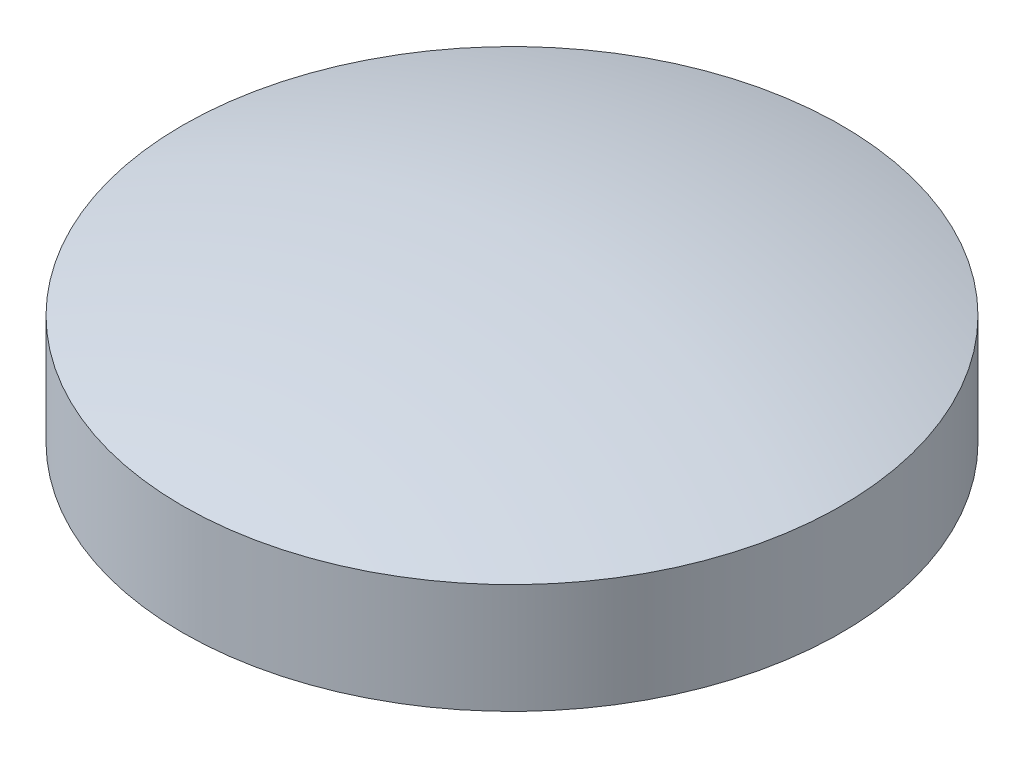
ISO-10303-21;
HEADER;
FILE_DESCRIPTION(('STEP AP214'),'2;1');
FILE_NAME('part.step','',(''),(''),'','','');
FILE_SCHEMA(('AUTOMOTIVE_DESIGN { 1 0 10303 214 1 1 1 1 }'));
ENDSEC;
DATA;
#1=APPLICATION_CONTEXT('core data for automotive mechanical design processes');
#2=APPLICATION_PROTOCOL_DEFINITION('international standard','automotive_design',2000,#1);
#3=PRODUCT_CONTEXT('',#1,'mechanical');
#4=PRODUCT('Part','Part','',(#3));
#5=PRODUCT_RELATED_PRODUCT_CATEGORY('part','',(#4));
#6=PRODUCT_DEFINITION_FORMATION('','',#4);
#7=PRODUCT_DEFINITION_CONTEXT('part definition',#1,'design');
#8=PRODUCT_DEFINITION('design','',#6,#7);
#9=PRODUCT_DEFINITION_SHAPE('','',#8);
#10=(LENGTH_UNIT() NAMED_UNIT(*) SI_UNIT(.MILLI.,.METRE.));
#11=(NAMED_UNIT(*) PLANE_ANGLE_UNIT() SI_UNIT($,.RADIAN.));
#12=(NAMED_UNIT(*) SI_UNIT($,.STERADIAN.) SOLID_ANGLE_UNIT());
#13=UNCERTAINTY_MEASURE_WITH_UNIT(LENGTH_MEASURE(1.E-05),#10,'distance_accuracy_value','');
#14=(GEOMETRIC_REPRESENTATION_CONTEXT(3) GLOBAL_UNCERTAINTY_ASSIGNED_CONTEXT((#13)) GLOBAL_UNIT_ASSIGNED_CONTEXT((#10,
#11,#12)) REPRESENTATION_CONTEXT('',''));
#15=CARTESIAN_POINT('',(0.,0.,0.));
#16=DIRECTION('',(0.,0.,1.));
#17=DIRECTION('',(1.,0.,0.));
#18=AXIS2_PLACEMENT_3D('',#15,#16,#17);
#19=CARTESIAN_POINT('',(0.,-5.42363520850167,0.));
#20=DIRECTION('',(0.,1.,0.));
#21=DIRECTION('',(-1.,0.,0.));
#22=AXIS2_PLACEMENT_3D('',#19,#20,#21);
#23=SPHERICAL_SURFACE('',#22,6.);
#24=CARTESIAN_POINT('',(0.,0.3,0.));
#25=DIRECTION('',(0.,1.,0.));
#26=DIRECTION('',(0.,0.,1.));
#27=AXIS2_PLACEMENT_3D('',#24,#25,#26);
#28=CIRCLE('',#27,1.8);
#29=CARTESIAN_POINT('',(0.,0.3,1.8));
#30=VERTEX_POINT('',#29);
#31=EDGE_CURVE('E10',#30,#30,#28,.T.);
#32=ORIENTED_EDGE('',*,*,#31,.T.);
#33=EDGE_LOOP('',(#32));
#34=FACE_BOUND('',#33,.T.);
#35=ADVANCED_FACE('F32',(#34),#23,.T.);
#36=CARTESIAN_POINT('',(0.,1.10783961392649,0.));
#37=DIRECTION('',(0.,1.,0.));
#38=DIRECTION('',(0.,0.,1.));
#39=AXIS2_PLACEMENT_3D('',#36,#37,#38);
#40=CYLINDRICAL_SURFACE('',#39,1.8);
#41=CARTESIAN_POINT('',(0.,-0.3,0.));
#42=DIRECTION('',(0.,1.,0.));
#43=DIRECTION('',(0.,0.,1.));
#44=AXIS2_PLACEMENT_3D('',#41,#42,#43);
#45=CIRCLE('',#44,1.8);
#46=CARTESIAN_POINT('',(0.,-0.3,1.8));
#47=VERTEX_POINT('',#46);
#48=EDGE_CURVE('E38',#47,#47,#45,.T.);
#49=ORIENTED_EDGE('',*,*,#48,.T.);
#50=EDGE_LOOP('',(#49));
#51=FACE_BOUND('',#50,.T.);
#52=ORIENTED_EDGE('',*,*,#31,.F.);
#53=EDGE_LOOP('',(#52));
#54=FACE_BOUND('',#53,.T.);
#55=ADVANCED_FACE('F44',(#51,#54),#40,.T.);
#56=CARTESIAN_POINT('',(0.,5.42363520850167,0.));
#57=DIRECTION('',(0.,1.,0.));
#58=DIRECTION('',(-1.,0.,0.));
#59=AXIS2_PLACEMENT_3D('',#56,#57,#58);
#60=SPHERICAL_SURFACE('',#59,6.);
#61=ORIENTED_EDGE('',*,*,#48,.F.);
#62=EDGE_LOOP('',(#61));
#63=FACE_BOUND('',#62,.T.);
#64=ADVANCED_FACE('F47',(#63),#60,.T.);
#65=CLOSED_SHELL('',(#35,#55,#64));
#66=MANIFOLD_SOLID_BREP('B2',#65);
#67=ADVANCED_BREP_SHAPE_REPRESENTATION('',(#18,#66),#14);
#68=SHAPE_DEFINITION_REPRESENTATION(#9,#67);
ENDSEC;
END-ISO-10303-21;
